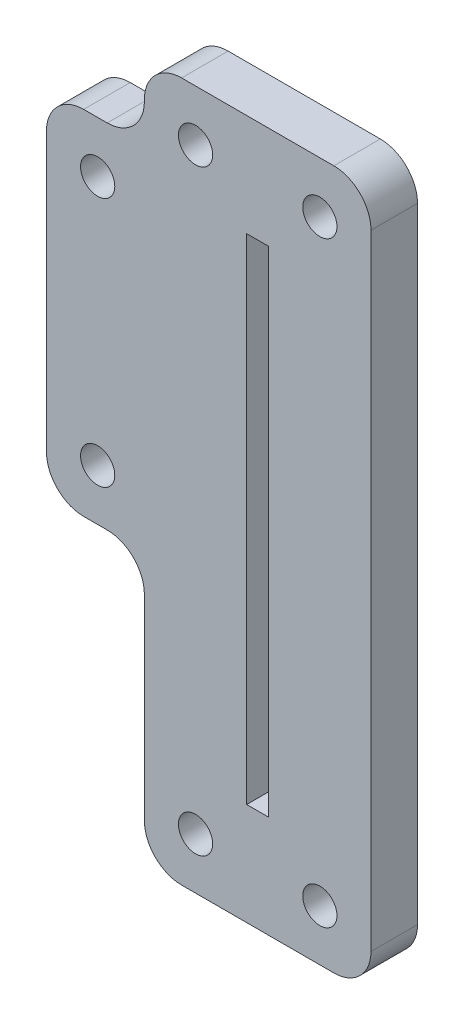
ISO-10303-21;
HEADER;
FILE_DESCRIPTION(('STEP AP214'),'2;1');
FILE_NAME('part.step','',(''),(''),'','','');
FILE_SCHEMA(('AUTOMOTIVE_DESIGN { 1 0 10303 214 1 1 1 1 }'));
ENDSEC;
DATA;
#1=APPLICATION_CONTEXT('core data for automotive mechanical design processes');
#2=APPLICATION_PROTOCOL_DEFINITION('international standard','automotive_design',2000,#1);
#3=PRODUCT_CONTEXT('',#1,'mechanical');
#4=PRODUCT('Part','Part','',(#3));
#5=PRODUCT_RELATED_PRODUCT_CATEGORY('part','',(#4));
#6=PRODUCT_DEFINITION_FORMATION('','',#4);
#7=PRODUCT_DEFINITION_CONTEXT('part definition',#1,'design');
#8=PRODUCT_DEFINITION('design','',#6,#7);
#9=PRODUCT_DEFINITION_SHAPE('','',#8);
#10=(LENGTH_UNIT() NAMED_UNIT(*) SI_UNIT(.MILLI.,.METRE.));
#11=(NAMED_UNIT(*) PLANE_ANGLE_UNIT() SI_UNIT($,.RADIAN.));
#12=(NAMED_UNIT(*) SI_UNIT($,.STERADIAN.) SOLID_ANGLE_UNIT());
#13=UNCERTAINTY_MEASURE_WITH_UNIT(LENGTH_MEASURE(1.E-05),#10,'distance_accuracy_value','');
#14=(GEOMETRIC_REPRESENTATION_CONTEXT(3) GLOBAL_UNCERTAINTY_ASSIGNED_CONTEXT((#13)) GLOBAL_UNIT_ASSIGNED_CONTEXT((#10,
#11,#12)) REPRESENTATION_CONTEXT('',''));
#15=CARTESIAN_POINT('',(0.,0.,0.));
#16=DIRECTION('',(0.,0.,1.));
#17=DIRECTION('',(1.,0.,0.));
#18=AXIS2_PLACEMENT_3D('',#15,#16,#17);
#19=CARTESIAN_POINT('',(-33.9932404035084,-3.58249069152293,3.175));
#20=DIRECTION('',(0.,0.,1.));
#21=DIRECTION('',(1.,0.,0.));
#22=AXIS2_PLACEMENT_3D('',#19,#20,#21);
#23=PLANE('',#22);
#24=CARTESIAN_POINT('',(-50.1132404035084,-9.73674069152292,3.175));
#25=DIRECTION('',(0.,0.,1.));
#26=DIRECTION('',(1.,0.,0.));
#27=AXIS2_PLACEMENT_3D('',#24,#25,#26);
#28=CIRCLE('',#27,1.1684);
#29=CARTESIAN_POINT('',(-48.9448404035084,-9.73674069152292,3.175));
#30=VERTEX_POINT('',#29);
#31=EDGE_CURVE('E656',#30,#30,#28,.T.);
#32=ORIENTED_EDGE('',*,*,#31,.F.);
#33=EDGE_LOOP('',(#32));
#34=FACE_BOUND('',#33,.T.);
#35=CARTESIAN_POINT('',(-43.4307404035084,-45.2699906915229,3.175));
#36=DIRECTION('',(0.,0.,1.));
#37=DIRECTION('',(1.,0.,0.));
#38=AXIS2_PLACEMENT_3D('',#35,#36,#37);
#39=CIRCLE('',#38,1.1684);
#40=CARTESIAN_POINT('',(-42.2623404035084,-45.2699906915229,3.175));
#41=VERTEX_POINT('',#40);
#42=EDGE_CURVE('E668',#41,#41,#39,.T.);
#43=ORIENTED_EDGE('',*,*,#42,.F.);
#44=EDGE_LOOP('',(#43));
#45=FACE_BOUND('',#44,.T.);
#46=DIRECTION('',(1.,0.,0.));
#47=VECTOR('',#46,1.);
#48=CARTESIAN_POINT('',(-39.9382404035084,-41.7774906915229,3.175));
#49=LINE('',#48,#47);
#50=CARTESIAN_POINT('',(-39.9382404035084,-41.7774906915229,3.175));
#51=VERTEX_POINT('',#50);
#52=CARTESIAN_POINT('',(-38.4382404035084,-41.7774906915229,3.175));
#53=VERTEX_POINT('',#52);
#54=EDGE_CURVE('E178',#51,#53,#49,.T.);
#55=ORIENTED_EDGE('',*,*,#54,.F.);
#56=DIRECTION('',(0.,-1.,0.));
#57=VECTOR('',#56,1.);
#58=CARTESIAN_POINT('',(-39.9382404035084,-8.02749069152292,3.175));
#59=LINE('',#58,#57);
#60=CARTESIAN_POINT('',(-39.9382404035084,-8.02749069152292,3.175));
#61=VERTEX_POINT('',#60);
#62=EDGE_CURVE('E170',#61,#51,#59,.T.);
#63=ORIENTED_EDGE('',*,*,#62,.F.);
#64=DIRECTION('',(-1.,0.,0.));
#65=VECTOR('',#64,1.);
#66=CARTESIAN_POINT('',(-39.9382404035084,-8.02749069152292,3.175));
#67=LINE('',#66,#65);
#68=CARTESIAN_POINT('',(-38.4382404035084,-8.02749069152292,3.175));
#69=VERTEX_POINT('',#68);
#70=EDGE_CURVE('E193',#69,#61,#67,.T.);
#71=ORIENTED_EDGE('',*,*,#70,.F.);
#72=DIRECTION('',(0.,1.,0.));
#73=VECTOR('',#72,1.);
#74=CARTESIAN_POINT('',(-38.4382404035084,-8.02749069152292,3.175));
#75=LINE('',#74,#73);
#76=EDGE_CURVE('E191',#53,#69,#75,.T.);
#77=ORIENTED_EDGE('',*,*,#76,.F.);
#78=EDGE_LOOP('',(#55,#63,#71,#77));
#79=FACE_BOUND('',#78,.T.);
#80=CARTESIAN_POINT('',(-33.9932404035084,-3.58249069152293,3.175));
#81=DIRECTION('',(0.,0.,1.));
#82=DIRECTION('',(1.,0.,0.));
#83=AXIS2_PLACEMENT_3D('',#80,#81,#82);
#84=CIRCLE('',#83,2.54);
#85=CARTESIAN_POINT('',(-31.4532404035084,-3.58249069152293,3.175));
#86=VERTEX_POINT('',#85);
#87=CARTESIAN_POINT('',(-33.9932404035084,-1.04249069152293,3.175));
#88=VERTEX_POINT('',#87);
#89=EDGE_CURVE('E215',#86,#88,#84,.T.);
#90=ORIENTED_EDGE('',*,*,#89,.T.);
#91=DIRECTION('',(-1.,0.,0.));
#92=VECTOR('',#91,1.);
#93=CARTESIAN_POINT('',(-44.3832404035084,-1.04249069152293,3.175));
#94=LINE('',#93,#92);
#95=CARTESIAN_POINT('',(-44.3832404035084,-1.04249069152293,3.175));
#96=VERTEX_POINT('',#95);
#97=EDGE_CURVE('E218',#88,#96,#94,.T.);
#98=ORIENTED_EDGE('',*,*,#97,.T.);
#99=CARTESIAN_POINT('',(-44.3832404035084,-3.58249069152293,3.175));
#100=DIRECTION('',(0.,0.,1.));
#101=DIRECTION('',(1.,0.,0.));
#102=AXIS2_PLACEMENT_3D('',#99,#100,#101);
#103=CIRCLE('',#102,2.54);
#104=CARTESIAN_POINT('',(-46.9232404035084,-3.58249069152294,3.175));
#105=VERTEX_POINT('',#104);
#106=EDGE_CURVE('E221',#96,#105,#103,.T.);
#107=ORIENTED_EDGE('',*,*,#106,.T.);
#108=DIRECTION('',(0.,-1.,0.));
#109=VECTOR('',#108,1.);
#110=CARTESIAN_POINT('',(-46.9232404035084,-3.58249069152294,3.175));
#111=LINE('',#110,#109);
#112=CARTESIAN_POINT('',(-46.9232404035084,-3.7042406915229,3.175));
#113=VERTEX_POINT('',#112);
#114=EDGE_CURVE('E223',#105,#113,#111,.T.);
#115=ORIENTED_EDGE('',*,*,#114,.T.);
#116=CARTESIAN_POINT('',(-49.4632404035084,-3.70424069152292,3.175));
#117=DIRECTION('',(0.,0.,-1.));
#118=DIRECTION('',(-1.,0.,0.));
#119=AXIS2_PLACEMENT_3D('',#116,#117,#118);
#120=CIRCLE('',#119,2.54);
#121=CARTESIAN_POINT('',(-49.4632404035084,-6.24424069152292,3.175));
#122=VERTEX_POINT('',#121);
#123=EDGE_CURVE('E225',#113,#122,#120,.T.);
#124=ORIENTED_EDGE('',*,*,#123,.T.);
#125=DIRECTION('',(-1.,0.,0.));
#126=VECTOR('',#125,1.);
#127=CARTESIAN_POINT('',(-51.0657404035084,-6.24424069152292,3.175));
#128=LINE('',#127,#126);
#129=CARTESIAN_POINT('',(-51.0657404035084,-6.24424069152292,3.175));
#130=VERTEX_POINT('',#129);
#131=EDGE_CURVE('E227',#122,#130,#128,.T.);
#132=ORIENTED_EDGE('',*,*,#131,.T.);
#133=CARTESIAN_POINT('',(-51.0657404035084,-8.78424069152292,3.175));
#134=DIRECTION('',(0.,0.,1.));
#135=DIRECTION('',(-1.,0.,0.));
#136=AXIS2_PLACEMENT_3D('',#133,#134,#135);
#137=CIRCLE('',#136,2.54);
#138=CARTESIAN_POINT('',(-53.6057404035084,-8.78424069152294,3.175));
#139=VERTEX_POINT('',#138);
#140=EDGE_CURVE('E229',#130,#139,#137,.T.);
#141=ORIENTED_EDGE('',*,*,#140,.T.);
#142=DIRECTION('',(0.,-1.,0.));
#143=VECTOR('',#142,1.);
#144=CARTESIAN_POINT('',(-53.6057404035084,-8.78424069152294,3.175));
#145=LINE('',#144,#143);
#146=CARTESIAN_POINT('',(-53.6057404035084,-27.7707406915229,3.175));
#147=VERTEX_POINT('',#146);
#148=EDGE_CURVE('E231',#139,#147,#145,.T.);
#149=ORIENTED_EDGE('',*,*,#148,.T.);
#150=CARTESIAN_POINT('',(-51.0657404035084,-27.7707406915229,3.175));
#151=DIRECTION('',(0.,0.,1.));
#152=DIRECTION('',(1.,0.,0.));
#153=AXIS2_PLACEMENT_3D('',#150,#151,#152);
#154=CIRCLE('',#153,2.54);
#155=CARTESIAN_POINT('',(-51.0657404035084,-30.3107406915229,3.175));
#156=VERTEX_POINT('',#155);
#157=EDGE_CURVE('E233',#147,#156,#154,.T.);
#158=ORIENTED_EDGE('',*,*,#157,.T.);
#159=DIRECTION('',(1.,0.,0.));
#160=VECTOR('',#159,1.);
#161=CARTESIAN_POINT('',(-49.4632404035084,-30.3107406915229,3.175));
#162=LINE('',#161,#160);
#163=CARTESIAN_POINT('',(-49.4632404035084,-30.3107406915229,3.175));
#164=VERTEX_POINT('',#163);
#165=EDGE_CURVE('E235',#156,#164,#162,.T.);
#166=ORIENTED_EDGE('',*,*,#165,.T.);
#167=CARTESIAN_POINT('',(-49.4632404035084,-32.8507406915229,3.175));
#168=DIRECTION('',(0.,0.,-1.));
#169=DIRECTION('',(1.,0.,0.));
#170=AXIS2_PLACEMENT_3D('',#167,#168,#169);
#171=CIRCLE('',#170,2.54);
#172=CARTESIAN_POINT('',(-46.9232404035084,-32.8507406915229,3.175));
#173=VERTEX_POINT('',#172);
#174=EDGE_CURVE('E237',#164,#173,#171,.T.);
#175=ORIENTED_EDGE('',*,*,#174,.T.);
#176=DIRECTION('',(0.,-1.,0.));
#177=VECTOR('',#176,1.);
#178=CARTESIAN_POINT('',(-46.9232404035084,-46.2224906915229,3.175));
#179=LINE('',#178,#177);
#180=CARTESIAN_POINT('',(-46.9232404035084,-46.2224906915229,3.175));
#181=VERTEX_POINT('',#180);
#182=EDGE_CURVE('E239',#173,#181,#179,.T.);
#183=ORIENTED_EDGE('',*,*,#182,.T.);
#184=CARTESIAN_POINT('',(-44.3832404035084,-46.2224906915229,3.175));
#185=DIRECTION('',(0.,0.,1.));
#186=DIRECTION('',(1.,0.,0.));
#187=AXIS2_PLACEMENT_3D('',#184,#185,#186);
#188=CIRCLE('',#187,2.54);
#189=CARTESIAN_POINT('',(-44.3832404035084,-48.7624906915229,3.175));
#190=VERTEX_POINT('',#189);
#191=EDGE_CURVE('E241',#181,#190,#188,.T.);
#192=ORIENTED_EDGE('',*,*,#191,.T.);
#193=DIRECTION('',(1.,0.,0.));
#194=VECTOR('',#193,1.);
#195=CARTESIAN_POINT('',(-44.3832404035084,-48.7624906915229,3.175));
#196=LINE('',#195,#194);
#197=CARTESIAN_POINT('',(-33.9932404035084,-48.7624906915229,3.175));
#198=VERTEX_POINT('',#197);
#199=EDGE_CURVE('E243',#190,#198,#196,.T.);
#200=ORIENTED_EDGE('',*,*,#199,.T.);
#201=CARTESIAN_POINT('',(-33.9932404035084,-46.2224906915229,3.175));
#202=DIRECTION('',(0.,0.,1.));
#203=DIRECTION('',(-1.,0.,0.));
#204=AXIS2_PLACEMENT_3D('',#201,#202,#203);
#205=CIRCLE('',#204,2.54);
#206=CARTESIAN_POINT('',(-31.4532404035084,-46.2224906915229,3.175));
#207=VERTEX_POINT('',#206);
#208=EDGE_CURVE('E245',#198,#207,#205,.T.);
#209=ORIENTED_EDGE('',*,*,#208,.T.);
#210=DIRECTION('',(0.,1.,0.));
#211=VECTOR('',#210,1.);
#212=CARTESIAN_POINT('',(-31.4532404035084,-3.58249069152293,3.175));
#213=LINE('',#212,#211);
#214=EDGE_CURVE('E247',#207,#86,#213,.T.);
#215=ORIENTED_EDGE('',*,*,#214,.T.);
#216=EDGE_LOOP('',(#90,#98,#107,#115,#124,#132,#141,#149,#158,#166,#175,#183,#192,#200,#209,#215));
#217=FACE_BOUND('',#216,.T.);
#218=CARTESIAN_POINT('',(-43.4307404035084,-4.53499069152293,3.175));
#219=DIRECTION('',(0.,0.,1.));
#220=DIRECTION('',(1.,0.,0.));
#221=AXIS2_PLACEMENT_3D('',#218,#219,#220);
#222=CIRCLE('',#221,1.1684);
#223=CARTESIAN_POINT('',(-42.2623404035084,-4.53499069152293,3.175));
#224=VERTEX_POINT('',#223);
#225=EDGE_CURVE('E209',#224,#224,#222,.T.);
#226=ORIENTED_EDGE('',*,*,#225,.F.);
#227=EDGE_LOOP('',(#226));
#228=FACE_BOUND('',#227,.T.);
#229=CARTESIAN_POINT('',(-34.9457404035084,-4.53499069152293,3.175));
#230=DIRECTION('',(0.,0.,1.));
#231=DIRECTION('',(1.,0.,0.));
#232=AXIS2_PLACEMENT_3D('',#229,#230,#231);
#233=CIRCLE('',#232,1.1684);
#234=CARTESIAN_POINT('',(-33.7773404035084,-4.53499069152293,3.175));
#235=VERTEX_POINT('',#234);
#236=EDGE_CURVE('E199',#235,#235,#233,.T.);
#237=ORIENTED_EDGE('',*,*,#236,.F.);
#238=EDGE_LOOP('',(#237));
#239=FACE_BOUND('',#238,.T.);
#240=CARTESIAN_POINT('',(-34.9457404035084,-45.2699906915229,3.175));
#241=DIRECTION('',(0.,0.,1.));
#242=DIRECTION('',(1.,0.,0.));
#243=AXIS2_PLACEMENT_3D('',#240,#241,#242);
#244=CIRCLE('',#243,1.1684);
#245=CARTESIAN_POINT('',(-33.7773404035084,-45.2699906915229,3.175));
#246=VERTEX_POINT('',#245);
#247=EDGE_CURVE('E662',#246,#246,#244,.T.);
#248=ORIENTED_EDGE('',*,*,#247,.F.);
#249=EDGE_LOOP('',(#248));
#250=FACE_BOUND('',#249,.T.);
#251=CARTESIAN_POINT('',(-50.1132404035084,-26.8182406915229,3.175));
#252=DIRECTION('',(0.,0.,1.));
#253=DIRECTION('',(1.,0.,0.));
#254=AXIS2_PLACEMENT_3D('',#251,#252,#253);
#255=CIRCLE('',#254,1.1684);
#256=CARTESIAN_POINT('',(-48.9448404035084,-26.8182406915229,3.175));
#257=VERTEX_POINT('',#256);
#258=EDGE_CURVE('E647',#257,#257,#255,.T.);
#259=ORIENTED_EDGE('',*,*,#258,.F.);
#260=EDGE_LOOP('',(#259));
#261=FACE_BOUND('',#260,.T.);
#262=ADVANCED_FACE('F33',(#34,#45,#79,#217,#228,#239,#250,#261),#23,.T.);
#263=CARTESIAN_POINT('',(-33.9932404035084,-3.58249069152293,0.));
#264=DIRECTION('',(0.,0.,1.));
#265=DIRECTION('',(1.,0.,0.));
#266=AXIS2_PLACEMENT_3D('',#263,#264,#265);
#267=PLANE('',#266);
#268=CARTESIAN_POINT('',(-50.1132404035084,-9.73674069152292,0.));
#269=DIRECTION('',(0.,0.,1.));
#270=DIRECTION('',(1.,0.,0.));
#271=AXIS2_PLACEMENT_3D('',#268,#269,#270);
#272=CIRCLE('',#271,1.1684);
#273=CARTESIAN_POINT('',(-48.9448404035084,-9.73674069152292,0.));
#274=VERTEX_POINT('',#273);
#275=EDGE_CURVE('E653',#274,#274,#272,.T.);
#276=ORIENTED_EDGE('',*,*,#275,.T.);
#277=EDGE_LOOP('',(#276));
#278=FACE_BOUND('',#277,.T.);
#279=CARTESIAN_POINT('',(-43.4307404035084,-45.2699906915229,0.));
#280=DIRECTION('',(0.,0.,1.));
#281=DIRECTION('',(1.,0.,0.));
#282=AXIS2_PLACEMENT_3D('',#279,#280,#281);
#283=CIRCLE('',#282,1.1684);
#284=CARTESIAN_POINT('',(-42.2623404035084,-45.2699906915229,0.));
#285=VERTEX_POINT('',#284);
#286=EDGE_CURVE('E665',#285,#285,#283,.T.);
#287=ORIENTED_EDGE('',*,*,#286,.T.);
#288=EDGE_LOOP('',(#287));
#289=FACE_BOUND('',#288,.T.);
#290=DIRECTION('',(0.,-1.,0.));
#291=VECTOR('',#290,1.);
#292=CARTESIAN_POINT('',(-39.9382404035084,-8.02749069152292,0.));
#293=LINE('',#292,#291);
#294=CARTESIAN_POINT('',(-39.9382404035084,-8.02749069152292,0.));
#295=VERTEX_POINT('',#294);
#296=CARTESIAN_POINT('',(-39.9382404035084,-41.7774906915229,0.));
#297=VERTEX_POINT('',#296);
#298=EDGE_CURVE('E56',#295,#297,#293,.T.);
#299=ORIENTED_EDGE('',*,*,#298,.T.);
#300=DIRECTION('',(1.,0.,0.));
#301=VECTOR('',#300,1.);
#302=CARTESIAN_POINT('',(-39.9382404035084,-41.7774906915229,0.));
#303=LINE('',#302,#301);
#304=CARTESIAN_POINT('',(-38.4382404035084,-41.7774906915229,0.));
#305=VERTEX_POINT('',#304);
#306=EDGE_CURVE('E185',#297,#305,#303,.T.);
#307=ORIENTED_EDGE('',*,*,#306,.T.);
#308=DIRECTION('',(0.,1.,0.));
#309=VECTOR('',#308,1.);
#310=CARTESIAN_POINT('',(-38.4382404035084,-8.02749069152292,0.));
#311=LINE('',#310,#309);
#312=CARTESIAN_POINT('',(-38.4382404035084,-8.02749069152292,0.));
#313=VERTEX_POINT('',#312);
#314=EDGE_CURVE('E201',#305,#313,#311,.T.);
#315=ORIENTED_EDGE('',*,*,#314,.T.);
#316=DIRECTION('',(-1.,0.,0.));
#317=VECTOR('',#316,1.);
#318=CARTESIAN_POINT('',(-39.9382404035084,-8.02749069152292,0.));
#319=LINE('',#318,#317);
#320=EDGE_CURVE('E179',#313,#295,#319,.T.);
#321=ORIENTED_EDGE('',*,*,#320,.T.);
#322=EDGE_LOOP('',(#299,#307,#315,#321));
#323=FACE_BOUND('',#322,.T.);
#324=CARTESIAN_POINT('',(-33.9932404035084,-3.58249069152293,0.));
#325=DIRECTION('',(0.,0.,1.));
#326=DIRECTION('',(1.,0.,0.));
#327=AXIS2_PLACEMENT_3D('',#324,#325,#326);
#328=CIRCLE('',#327,2.54);
#329=CARTESIAN_POINT('',(-31.4532404035084,-3.58249069152293,0.));
#330=VERTEX_POINT('',#329);
#331=CARTESIAN_POINT('',(-33.9932404035084,-1.04249069152293,0.));
#332=VERTEX_POINT('',#331);
#333=EDGE_CURVE('E212',#330,#332,#328,.T.);
#334=ORIENTED_EDGE('',*,*,#333,.F.);
#335=DIRECTION('',(0.,1.,0.));
#336=VECTOR('',#335,1.);
#337=CARTESIAN_POINT('',(-31.4532404035084,-3.58249069152293,0.));
#338=LINE('',#337,#336);
#339=CARTESIAN_POINT('',(-31.4532404035084,-46.2224906915229,0.));
#340=VERTEX_POINT('',#339);
#341=EDGE_CURVE('E219',#340,#330,#338,.T.);
#342=ORIENTED_EDGE('',*,*,#341,.F.);
#343=CARTESIAN_POINT('',(-33.9932404035084,-46.2224906915229,0.));
#344=DIRECTION('',(0.,0.,1.));
#345=DIRECTION('',(-1.,0.,0.));
#346=AXIS2_PLACEMENT_3D('',#343,#344,#345);
#347=CIRCLE('',#346,2.54);
#348=CARTESIAN_POINT('',(-33.9932404035084,-48.7624906915229,0.));
#349=VERTEX_POINT('',#348);
#350=EDGE_CURVE('E278',#349,#340,#347,.T.);
#351=ORIENTED_EDGE('',*,*,#350,.F.);
#352=DIRECTION('',(1.,0.,0.));
#353=VECTOR('',#352,1.);
#354=CARTESIAN_POINT('',(-44.3832404035084,-48.7624906915229,0.));
#355=LINE('',#354,#353);
#356=CARTESIAN_POINT('',(-44.3832404035084,-48.7624906915229,0.));
#357=VERTEX_POINT('',#356);
#358=EDGE_CURVE('E276',#357,#349,#355,.T.);
#359=ORIENTED_EDGE('',*,*,#358,.F.);
#360=CARTESIAN_POINT('',(-44.3832404035084,-46.2224906915229,0.));
#361=DIRECTION('',(0.,0.,1.));
#362=DIRECTION('',(1.,0.,0.));
#363=AXIS2_PLACEMENT_3D('',#360,#361,#362);
#364=CIRCLE('',#363,2.54);
#365=CARTESIAN_POINT('',(-46.9232404035084,-46.2224906915229,0.));
#366=VERTEX_POINT('',#365);
#367=EDGE_CURVE('E274',#366,#357,#364,.T.);
#368=ORIENTED_EDGE('',*,*,#367,.F.);
#369=DIRECTION('',(0.,-1.,0.));
#370=VECTOR('',#369,1.);
#371=CARTESIAN_POINT('',(-46.9232404035084,-46.2224906915229,0.));
#372=LINE('',#371,#370);
#373=CARTESIAN_POINT('',(-46.9232404035084,-32.8507406915229,0.));
#374=VERTEX_POINT('',#373);
#375=EDGE_CURVE('E272',#374,#366,#372,.T.);
#376=ORIENTED_EDGE('',*,*,#375,.F.);
#377=CARTESIAN_POINT('',(-49.4632404035084,-32.8507406915229,0.));
#378=DIRECTION('',(0.,0.,-1.));
#379=DIRECTION('',(1.,0.,0.));
#380=AXIS2_PLACEMENT_3D('',#377,#378,#379);
#381=CIRCLE('',#380,2.54);
#382=CARTESIAN_POINT('',(-49.4632404035084,-30.3107406915229,0.));
#383=VERTEX_POINT('',#382);
#384=EDGE_CURVE('E270',#383,#374,#381,.T.);
#385=ORIENTED_EDGE('',*,*,#384,.F.);
#386=DIRECTION('',(1.,0.,0.));
#387=VECTOR('',#386,1.);
#388=CARTESIAN_POINT('',(-49.4632404035084,-30.3107406915229,0.));
#389=LINE('',#388,#387);
#390=CARTESIAN_POINT('',(-51.0657404035084,-30.3107406915229,0.));
#391=VERTEX_POINT('',#390);
#392=EDGE_CURVE('E268',#391,#383,#389,.T.);
#393=ORIENTED_EDGE('',*,*,#392,.F.);
#394=CARTESIAN_POINT('',(-51.0657404035084,-27.7707406915229,0.));
#395=DIRECTION('',(0.,0.,1.));
#396=DIRECTION('',(1.,0.,0.));
#397=AXIS2_PLACEMENT_3D('',#394,#395,#396);
#398=CIRCLE('',#397,2.54);
#399=CARTESIAN_POINT('',(-53.6057404035084,-27.7707406915229,0.));
#400=VERTEX_POINT('',#399);
#401=EDGE_CURVE('E266',#400,#391,#398,.T.);
#402=ORIENTED_EDGE('',*,*,#401,.F.);
#403=DIRECTION('',(0.,-1.,0.));
#404=VECTOR('',#403,1.);
#405=CARTESIAN_POINT('',(-53.6057404035084,-8.78424069152294,0.));
#406=LINE('',#405,#404);
#407=CARTESIAN_POINT('',(-53.6057404035084,-8.78424069152294,0.));
#408=VERTEX_POINT('',#407);
#409=EDGE_CURVE('E264',#408,#400,#406,.T.);
#410=ORIENTED_EDGE('',*,*,#409,.F.);
#411=CARTESIAN_POINT('',(-51.0657404035084,-8.78424069152292,0.));
#412=DIRECTION('',(0.,0.,1.));
#413=DIRECTION('',(-1.,0.,0.));
#414=AXIS2_PLACEMENT_3D('',#411,#412,#413);
#415=CIRCLE('',#414,2.54);
#416=CARTESIAN_POINT('',(-51.0657404035084,-6.24424069152292,0.));
#417=VERTEX_POINT('',#416);
#418=EDGE_CURVE('E262',#417,#408,#415,.T.);
#419=ORIENTED_EDGE('',*,*,#418,.F.);
#420=DIRECTION('',(-1.,0.,0.));
#421=VECTOR('',#420,1.);
#422=CARTESIAN_POINT('',(-51.0657404035084,-6.24424069152292,0.));
#423=LINE('',#422,#421);
#424=CARTESIAN_POINT('',(-49.4632404035084,-6.24424069152292,0.));
#425=VERTEX_POINT('',#424);
#426=EDGE_CURVE('E260',#425,#417,#423,.T.);
#427=ORIENTED_EDGE('',*,*,#426,.F.);
#428=CARTESIAN_POINT('',(-49.4632404035084,-3.70424069152292,0.));
#429=DIRECTION('',(0.,0.,-1.));
#430=DIRECTION('',(-1.,0.,0.));
#431=AXIS2_PLACEMENT_3D('',#428,#429,#430);
#432=CIRCLE('',#431,2.54);
#433=CARTESIAN_POINT('',(-46.9232404035084,-3.7042406915229,0.));
#434=VERTEX_POINT('',#433);
#435=EDGE_CURVE('E258',#434,#425,#432,.T.);
#436=ORIENTED_EDGE('',*,*,#435,.F.);
#437=DIRECTION('',(0.,-1.,0.));
#438=VECTOR('',#437,1.);
#439=CARTESIAN_POINT('',(-46.9232404035084,-3.58249069152294,0.));
#440=LINE('',#439,#438);
#441=CARTESIAN_POINT('',(-46.9232404035084,-3.58249069152294,0.));
#442=VERTEX_POINT('',#441);
#443=EDGE_CURVE('E256',#442,#434,#440,.T.);
#444=ORIENTED_EDGE('',*,*,#443,.F.);
#445=CARTESIAN_POINT('',(-44.3832404035084,-3.58249069152293,0.));
#446=DIRECTION('',(0.,0.,1.));
#447=DIRECTION('',(1.,0.,0.));
#448=AXIS2_PLACEMENT_3D('',#445,#446,#447);
#449=CIRCLE('',#448,2.54);
#450=CARTESIAN_POINT('',(-44.3832404035084,-1.04249069152293,0.));
#451=VERTEX_POINT('',#450);
#452=EDGE_CURVE('E254',#451,#442,#449,.T.);
#453=ORIENTED_EDGE('',*,*,#452,.F.);
#454=DIRECTION('',(-1.,0.,0.));
#455=VECTOR('',#454,1.);
#456=CARTESIAN_POINT('',(-44.3832404035084,-1.04249069152293,0.));
#457=LINE('',#456,#455);
#458=EDGE_CURVE('E252',#332,#451,#457,.T.);
#459=ORIENTED_EDGE('',*,*,#458,.F.);
#460=EDGE_LOOP('',(#334,#342,#351,#359,#368,#376,#385,#393,#402,#410,#419,#427,#436,#444,#453,#459));
#461=FACE_BOUND('',#460,.T.);
#462=CARTESIAN_POINT('',(-43.4307404035084,-4.53499069152293,0.));
#463=DIRECTION('',(0.,0.,1.));
#464=DIRECTION('',(1.,0.,0.));
#465=AXIS2_PLACEMENT_3D('',#462,#463,#464);
#466=CIRCLE('',#465,1.1684);
#467=CARTESIAN_POINT('',(-42.2623404035084,-4.53499069152293,0.));
#468=VERTEX_POINT('',#467);
#469=EDGE_CURVE('E186',#468,#468,#466,.T.);
#470=ORIENTED_EDGE('',*,*,#469,.T.);
#471=EDGE_LOOP('',(#470));
#472=FACE_BOUND('',#471,.T.);
#473=CARTESIAN_POINT('',(-34.9457404035084,-4.53499069152293,0.));
#474=DIRECTION('',(0.,0.,1.));
#475=DIRECTION('',(1.,0.,0.));
#476=AXIS2_PLACEMENT_3D('',#473,#474,#475);
#477=CIRCLE('',#476,1.1684);
#478=CARTESIAN_POINT('',(-33.7773404035084,-4.53499069152293,0.));
#479=VERTEX_POINT('',#478);
#480=EDGE_CURVE('E671',#479,#479,#477,.T.);
#481=ORIENTED_EDGE('',*,*,#480,.T.);
#482=EDGE_LOOP('',(#481));
#483=FACE_BOUND('',#482,.T.);
#484=CARTESIAN_POINT('',(-34.9457404035084,-45.2699906915229,0.));
#485=DIRECTION('',(0.,0.,1.));
#486=DIRECTION('',(1.,0.,0.));
#487=AXIS2_PLACEMENT_3D('',#484,#485,#486);
#488=CIRCLE('',#487,1.1684);
#489=CARTESIAN_POINT('',(-33.7773404035084,-45.2699906915229,0.));
#490=VERTEX_POINT('',#489);
#491=EDGE_CURVE('E659',#490,#490,#488,.T.);
#492=ORIENTED_EDGE('',*,*,#491,.T.);
#493=EDGE_LOOP('',(#492));
#494=FACE_BOUND('',#493,.T.);
#495=CARTESIAN_POINT('',(-50.1132404035084,-26.8182406915229,0.));
#496=DIRECTION('',(0.,0.,1.));
#497=DIRECTION('',(1.,0.,0.));
#498=AXIS2_PLACEMENT_3D('',#495,#496,#497);
#499=CIRCLE('',#498,1.1684);
#500=CARTESIAN_POINT('',(-48.9448404035084,-26.8182406915229,0.));
#501=VERTEX_POINT('',#500);
#502=EDGE_CURVE('E650',#501,#501,#499,.T.);
#503=ORIENTED_EDGE('',*,*,#502,.T.);
#504=EDGE_LOOP('',(#503));
#505=FACE_BOUND('',#504,.T.);
#506=ADVANCED_FACE('F332',(#278,#289,#323,#461,#472,#483,#494,#505),#267,.F.);
#507=CARTESIAN_POINT('',(-33.9932404035084,-3.58249069152293,3.175));
#508=DIRECTION('',(0.,0.,-1.));
#509=DIRECTION('',(-1.,0.,0.));
#510=AXIS2_PLACEMENT_3D('',#507,#508,#509);
#511=CYLINDRICAL_SURFACE('',#510,2.54);
#512=ORIENTED_EDGE('',*,*,#333,.T.);
#513=DIRECTION('',(0.,0.,-1.));
#514=VECTOR('',#513,1.);
#515=CARTESIAN_POINT('',(-33.9932404035084,-1.04249069152293,3.175));
#516=LINE('',#515,#514);
#517=EDGE_CURVE('E11',#88,#332,#516,.T.);
#518=ORIENTED_EDGE('',*,*,#517,.F.);
#519=ORIENTED_EDGE('',*,*,#89,.F.);
#520=DIRECTION('',(0.,0.,-1.));
#521=VECTOR('',#520,1.);
#522=CARTESIAN_POINT('',(-31.4532404035084,-3.58249069152293,3.175));
#523=LINE('',#522,#521);
#524=EDGE_CURVE('E249',#86,#330,#523,.T.);
#525=ORIENTED_EDGE('',*,*,#524,.T.);
#526=EDGE_LOOP('',(#512,#518,#519,#525));
#527=FACE_BOUND('',#526,.T.);
#528=ADVANCED_FACE('F35',(#527),#511,.T.);
#529=CARTESIAN_POINT('',(-44.3832404035084,-1.04249069152293,3.175));
#530=DIRECTION('',(0.,-1.,0.));
#531=DIRECTION('',(0.,0.,-1.));
#532=AXIS2_PLACEMENT_3D('',#529,#530,#531);
#533=PLANE('',#532);
#534=ORIENTED_EDGE('',*,*,#458,.T.);
#535=DIRECTION('',(0.,0.,-1.));
#536=VECTOR('',#535,1.);
#537=CARTESIAN_POINT('',(-44.3832404035084,-1.04249069152293,3.175));
#538=LINE('',#537,#536);
#539=EDGE_CURVE('E41',#96,#451,#538,.T.);
#540=ORIENTED_EDGE('',*,*,#539,.F.);
#541=ORIENTED_EDGE('',*,*,#97,.F.);
#542=ORIENTED_EDGE('',*,*,#517,.T.);
#543=EDGE_LOOP('',(#534,#540,#541,#542));
#544=FACE_BOUND('',#543,.T.);
#545=ADVANCED_FACE('F349',(#544),#533,.F.);
#546=CARTESIAN_POINT('',(-44.3832404035084,-3.58249069152293,3.175));
#547=DIRECTION('',(0.,0.,-1.));
#548=DIRECTION('',(-1.,0.,0.));
#549=AXIS2_PLACEMENT_3D('',#546,#547,#548);
#550=CYLINDRICAL_SURFACE('',#549,2.54);
#551=ORIENTED_EDGE('',*,*,#452,.T.);
#552=DIRECTION('',(0.,0.,-1.));
#553=VECTOR('',#552,1.);
#554=CARTESIAN_POINT('',(-46.9232404035084,-3.58249069152294,3.175));
#555=LINE('',#554,#553);
#556=EDGE_CURVE('E319',#105,#442,#555,.T.);
#557=ORIENTED_EDGE('',*,*,#556,.F.);
#558=ORIENTED_EDGE('',*,*,#106,.F.);
#559=ORIENTED_EDGE('',*,*,#539,.T.);
#560=EDGE_LOOP('',(#551,#557,#558,#559));
#561=FACE_BOUND('',#560,.T.);
#562=ADVANCED_FACE('F326',(#561),#550,.T.);
#563=CARTESIAN_POINT('',(-46.9232404035084,-3.58249069152294,3.175));
#564=DIRECTION('',(1.,0.,0.));
#565=DIRECTION('',(0.,0.,-1.));
#566=AXIS2_PLACEMENT_3D('',#563,#564,#565);
#567=PLANE('',#566);
#568=ORIENTED_EDGE('',*,*,#443,.T.);
#569=DIRECTION('',(0.,0.,-1.));
#570=VECTOR('',#569,1.);
#571=CARTESIAN_POINT('',(-46.9232404035084,-3.7042406915229,3.175));
#572=LINE('',#571,#570);
#573=EDGE_CURVE('E316',#113,#434,#572,.T.);
#574=ORIENTED_EDGE('',*,*,#573,.F.);
#575=ORIENTED_EDGE('',*,*,#114,.F.);
#576=ORIENTED_EDGE('',*,*,#556,.T.);
#577=EDGE_LOOP('',(#568,#574,#575,#576));
#578=FACE_BOUND('',#577,.T.);
#579=ADVANCED_FACE('F338',(#578),#567,.F.);
#580=CARTESIAN_POINT('',(-49.4632404035084,-3.70424069152292,3.175));
#581=DIRECTION('',(0.,0.,-1.));
#582=DIRECTION('',(-1.,0.,0.));
#583=AXIS2_PLACEMENT_3D('',#580,#581,#582);
#584=CYLINDRICAL_SURFACE('',#583,2.54);
#585=ORIENTED_EDGE('',*,*,#435,.T.);
#586=DIRECTION('',(0.,0.,-1.));
#587=VECTOR('',#586,1.);
#588=CARTESIAN_POINT('',(-49.4632404035084,-6.24424069152292,3.175));
#589=LINE('',#588,#587);
#590=EDGE_CURVE('E313',#122,#425,#589,.T.);
#591=ORIENTED_EDGE('',*,*,#590,.F.);
#592=ORIENTED_EDGE('',*,*,#123,.F.);
#593=ORIENTED_EDGE('',*,*,#573,.T.);
#594=EDGE_LOOP('',(#585,#591,#592,#593));
#595=FACE_BOUND('',#594,.T.);
#596=ADVANCED_FACE('F342',(#595),#584,.F.);
#597=CARTESIAN_POINT('',(-51.0657404035084,-6.24424069152292,3.175));
#598=DIRECTION('',(0.,-1.,0.));
#599=DIRECTION('',(0.,0.,-1.));
#600=AXIS2_PLACEMENT_3D('',#597,#598,#599);
#601=PLANE('',#600);
#602=ORIENTED_EDGE('',*,*,#426,.T.);
#603=DIRECTION('',(0.,0.,-1.));
#604=VECTOR('',#603,1.);
#605=CARTESIAN_POINT('',(-51.0657404035084,-6.24424069152292,3.175));
#606=LINE('',#605,#604);
#607=EDGE_CURVE('E310',#130,#417,#606,.T.);
#608=ORIENTED_EDGE('',*,*,#607,.F.);
#609=ORIENTED_EDGE('',*,*,#131,.F.);
#610=ORIENTED_EDGE('',*,*,#590,.T.);
#611=EDGE_LOOP('',(#602,#608,#609,#610));
#612=FACE_BOUND('',#611,.T.);
#613=ADVANCED_FACE('F402',(#612),#601,.F.);
#614=CARTESIAN_POINT('',(-51.0657404035084,-8.78424069152292,3.175));
#615=DIRECTION('',(0.,0.,-1.));
#616=DIRECTION('',(-1.,0.,0.));
#617=AXIS2_PLACEMENT_3D('',#614,#615,#616);
#618=CYLINDRICAL_SURFACE('',#617,2.54);
#619=ORIENTED_EDGE('',*,*,#418,.T.);
#620=DIRECTION('',(0.,0.,-1.));
#621=VECTOR('',#620,1.);
#622=CARTESIAN_POINT('',(-53.6057404035084,-8.78424069152294,3.175));
#623=LINE('',#622,#621);
#624=EDGE_CURVE('E307',#139,#408,#623,.T.);
#625=ORIENTED_EDGE('',*,*,#624,.F.);
#626=ORIENTED_EDGE('',*,*,#140,.F.);
#627=ORIENTED_EDGE('',*,*,#607,.T.);
#628=EDGE_LOOP('',(#619,#625,#626,#627));
#629=FACE_BOUND('',#628,.T.);
#630=ADVANCED_FACE('F399',(#629),#618,.T.);
#631=CARTESIAN_POINT('',(-53.6057404035084,-8.78424069152294,3.175));
#632=DIRECTION('',(1.,0.,0.));
#633=DIRECTION('',(0.,0.,-1.));
#634=AXIS2_PLACEMENT_3D('',#631,#632,#633);
#635=PLANE('',#634);
#636=ORIENTED_EDGE('',*,*,#409,.T.);
#637=DIRECTION('',(0.,0.,-1.));
#638=VECTOR('',#637,1.);
#639=CARTESIAN_POINT('',(-53.6057404035084,-27.7707406915229,3.175));
#640=LINE('',#639,#638);
#641=EDGE_CURVE('E304',#147,#400,#640,.T.);
#642=ORIENTED_EDGE('',*,*,#641,.F.);
#643=ORIENTED_EDGE('',*,*,#148,.F.);
#644=ORIENTED_EDGE('',*,*,#624,.T.);
#645=EDGE_LOOP('',(#636,#642,#643,#644));
#646=FACE_BOUND('',#645,.T.);
#647=ADVANCED_FACE('F395',(#646),#635,.F.);
#648=CARTESIAN_POINT('',(-51.0657404035084,-27.7707406915229,3.175));
#649=DIRECTION('',(0.,0.,-1.));
#650=DIRECTION('',(-1.,0.,0.));
#651=AXIS2_PLACEMENT_3D('',#648,#649,#650);
#652=CYLINDRICAL_SURFACE('',#651,2.54);
#653=ORIENTED_EDGE('',*,*,#401,.T.);
#654=DIRECTION('',(0.,0.,-1.));
#655=VECTOR('',#654,1.);
#656=CARTESIAN_POINT('',(-51.0657404035084,-30.3107406915229,3.175));
#657=LINE('',#656,#655);
#658=EDGE_CURVE('E301',#156,#391,#657,.T.);
#659=ORIENTED_EDGE('',*,*,#658,.F.);
#660=ORIENTED_EDGE('',*,*,#157,.F.);
#661=ORIENTED_EDGE('',*,*,#641,.T.);
#662=EDGE_LOOP('',(#653,#659,#660,#661));
#663=FACE_BOUND('',#662,.T.);
#664=ADVANCED_FACE('F391',(#663),#652,.T.);
#665=CARTESIAN_POINT('',(-49.4632404035084,-30.3107406915229,3.175));
#666=DIRECTION('',(0.,1.,0.));
#667=DIRECTION('',(0.,0.,1.));
#668=AXIS2_PLACEMENT_3D('',#665,#666,#667);
#669=PLANE('',#668);
#670=ORIENTED_EDGE('',*,*,#392,.T.);
#671=DIRECTION('',(0.,0.,-1.));
#672=VECTOR('',#671,1.);
#673=CARTESIAN_POINT('',(-49.4632404035084,-30.3107406915229,3.175));
#674=LINE('',#673,#672);
#675=EDGE_CURVE('E298',#164,#383,#674,.T.);
#676=ORIENTED_EDGE('',*,*,#675,.F.);
#677=ORIENTED_EDGE('',*,*,#165,.F.);
#678=ORIENTED_EDGE('',*,*,#658,.T.);
#679=EDGE_LOOP('',(#670,#676,#677,#678));
#680=FACE_BOUND('',#679,.T.);
#681=ADVANCED_FACE('F386',(#680),#669,.F.);
#682=CARTESIAN_POINT('',(-49.4632404035084,-32.8507406915229,3.175));
#683=DIRECTION('',(0.,0.,-1.));
#684=DIRECTION('',(-1.,0.,0.));
#685=AXIS2_PLACEMENT_3D('',#682,#683,#684);
#686=CYLINDRICAL_SURFACE('',#685,2.54);
#687=ORIENTED_EDGE('',*,*,#384,.T.);
#688=DIRECTION('',(0.,0.,-1.));
#689=VECTOR('',#688,1.);
#690=CARTESIAN_POINT('',(-46.9232404035084,-32.8507406915229,3.175));
#691=LINE('',#690,#689);
#692=EDGE_CURVE('E295',#173,#374,#691,.T.);
#693=ORIENTED_EDGE('',*,*,#692,.F.);
#694=ORIENTED_EDGE('',*,*,#174,.F.);
#695=ORIENTED_EDGE('',*,*,#675,.T.);
#696=EDGE_LOOP('',(#687,#693,#694,#695));
#697=FACE_BOUND('',#696,.T.);
#698=ADVANCED_FACE('F380',(#697),#686,.F.);
#699=CARTESIAN_POINT('',(-46.9232404035084,-46.2224906915229,3.175));
#700=DIRECTION('',(1.,0.,0.));
#701=DIRECTION('',(0.,0.,-1.));
#702=AXIS2_PLACEMENT_3D('',#699,#700,#701);
#703=PLANE('',#702);
#704=ORIENTED_EDGE('',*,*,#375,.T.);
#705=DIRECTION('',(0.,0.,-1.));
#706=VECTOR('',#705,1.);
#707=CARTESIAN_POINT('',(-46.9232404035084,-46.2224906915229,3.175));
#708=LINE('',#707,#706);
#709=EDGE_CURVE('E292',#181,#366,#708,.T.);
#710=ORIENTED_EDGE('',*,*,#709,.F.);
#711=ORIENTED_EDGE('',*,*,#182,.F.);
#712=ORIENTED_EDGE('',*,*,#692,.T.);
#713=EDGE_LOOP('',(#704,#710,#711,#712));
#714=FACE_BOUND('',#713,.T.);
#715=ADVANCED_FACE('F376',(#714),#703,.F.);
#716=CARTESIAN_POINT('',(-44.3832404035084,-46.2224906915229,3.175));
#717=DIRECTION('',(0.,0.,-1.));
#718=DIRECTION('',(-1.,0.,0.));
#719=AXIS2_PLACEMENT_3D('',#716,#717,#718);
#720=CYLINDRICAL_SURFACE('',#719,2.54);
#721=ORIENTED_EDGE('',*,*,#367,.T.);
#722=DIRECTION('',(0.,0.,-1.));
#723=VECTOR('',#722,1.);
#724=CARTESIAN_POINT('',(-44.3832404035084,-48.7624906915229,3.175));
#725=LINE('',#724,#723);
#726=EDGE_CURVE('E289',#190,#357,#725,.T.);
#727=ORIENTED_EDGE('',*,*,#726,.F.);
#728=ORIENTED_EDGE('',*,*,#191,.F.);
#729=ORIENTED_EDGE('',*,*,#709,.T.);
#730=EDGE_LOOP('',(#721,#727,#728,#729));
#731=FACE_BOUND('',#730,.T.);
#732=ADVANCED_FACE('F371',(#731),#720,.T.);
#733=CARTESIAN_POINT('',(-44.3832404035084,-48.7624906915229,3.175));
#734=DIRECTION('',(0.,1.,0.));
#735=DIRECTION('',(-1.,0.,0.));
#736=AXIS2_PLACEMENT_3D('',#733,#734,#735);
#737=PLANE('',#736);
#738=ORIENTED_EDGE('',*,*,#358,.T.);
#739=DIRECTION('',(0.,0.,-1.));
#740=VECTOR('',#739,1.);
#741=CARTESIAN_POINT('',(-33.9932404035084,-48.7624906915229,3.175));
#742=LINE('',#741,#740);
#743=EDGE_CURVE('E286',#198,#349,#742,.T.);
#744=ORIENTED_EDGE('',*,*,#743,.F.);
#745=ORIENTED_EDGE('',*,*,#199,.F.);
#746=ORIENTED_EDGE('',*,*,#726,.T.);
#747=EDGE_LOOP('',(#738,#744,#745,#746));
#748=FACE_BOUND('',#747,.T.);
#749=ADVANCED_FACE('F365',(#748),#737,.F.);
#750=CARTESIAN_POINT('',(-33.9932404035084,-46.2224906915229,3.175));
#751=DIRECTION('',(0.,0.,-1.));
#752=DIRECTION('',(-1.,0.,0.));
#753=AXIS2_PLACEMENT_3D('',#750,#751,#752);
#754=CYLINDRICAL_SURFACE('',#753,2.54);
#755=ORIENTED_EDGE('',*,*,#350,.T.);
#756=DIRECTION('',(0.,0.,-1.));
#757=VECTOR('',#756,1.);
#758=CARTESIAN_POINT('',(-31.4532404035084,-46.2224906915229,3.175));
#759=LINE('',#758,#757);
#760=EDGE_CURVE('E283',#207,#340,#759,.T.);
#761=ORIENTED_EDGE('',*,*,#760,.F.);
#762=ORIENTED_EDGE('',*,*,#208,.F.);
#763=ORIENTED_EDGE('',*,*,#743,.T.);
#764=EDGE_LOOP('',(#755,#761,#762,#763));
#765=FACE_BOUND('',#764,.T.);
#766=ADVANCED_FACE('F361',(#765),#754,.T.);
#767=CARTESIAN_POINT('',(-31.4532404035084,-3.58249069152293,3.175));
#768=DIRECTION('',(-1.,0.,0.));
#769=DIRECTION('',(0.,-1.,0.));
#770=AXIS2_PLACEMENT_3D('',#767,#768,#769);
#771=PLANE('',#770);
#772=ORIENTED_EDGE('',*,*,#341,.T.);
#773=ORIENTED_EDGE('',*,*,#524,.F.);
#774=ORIENTED_EDGE('',*,*,#214,.F.);
#775=ORIENTED_EDGE('',*,*,#760,.T.);
#776=EDGE_LOOP('',(#772,#773,#774,#775));
#777=FACE_BOUND('',#776,.T.);
#778=ADVANCED_FACE('F356',(#777),#771,.F.);
#779=CARTESIAN_POINT('',(-43.4307404035084,-4.53499069152293,3.175));
#780=DIRECTION('',(0.,0.,-1.));
#781=DIRECTION('',(-1.,0.,0.));
#782=AXIS2_PLACEMENT_3D('',#779,#780,#781);
#783=CYLINDRICAL_SURFACE('',#782,1.1684);
#784=ORIENTED_EDGE('',*,*,#225,.T.);
#785=EDGE_LOOP('',(#784));
#786=FACE_BOUND('',#785,.T.);
#787=ORIENTED_EDGE('',*,*,#469,.F.);
#788=EDGE_LOOP('',(#787));
#789=FACE_BOUND('',#788,.T.);
#790=ADVANCED_FACE('F422',(#786,#789),#783,.F.);
#791=CARTESIAN_POINT('',(-39.9382404035084,-8.02749069152292,3.175));
#792=DIRECTION('',(1.,0.,0.));
#793=DIRECTION('',(0.,1.,0.));
#794=AXIS2_PLACEMENT_3D('',#791,#792,#793);
#795=PLANE('',#794);
#796=ORIENTED_EDGE('',*,*,#298,.F.);
#797=DIRECTION('',(0.,0.,-1.));
#798=VECTOR('',#797,1.);
#799=CARTESIAN_POINT('',(-39.9382404035084,-8.02749069152292,3.175));
#800=LINE('',#799,#798);
#801=EDGE_CURVE('E174',#61,#295,#800,.T.);
#802=ORIENTED_EDGE('',*,*,#801,.F.);
#803=ORIENTED_EDGE('',*,*,#62,.T.);
#804=DIRECTION('',(0.,0.,-1.));
#805=VECTOR('',#804,1.);
#806=CARTESIAN_POINT('',(-39.9382404035084,-41.7774906915229,3.175));
#807=LINE('',#806,#805);
#808=EDGE_CURVE('E173',#51,#297,#807,.T.);
#809=ORIENTED_EDGE('',*,*,#808,.T.);
#810=EDGE_LOOP('',(#796,#802,#803,#809));
#811=FACE_BOUND('',#810,.T.);
#812=ADVANCED_FACE('F172',(#811),#795,.T.);
#813=CARTESIAN_POINT('',(-39.9382404035084,-41.7774906915229,3.175));
#814=DIRECTION('',(0.,1.,0.));
#815=DIRECTION('',(0.,0.,1.));
#816=AXIS2_PLACEMENT_3D('',#813,#814,#815);
#817=PLANE('',#816);
#818=ORIENTED_EDGE('',*,*,#306,.F.);
#819=ORIENTED_EDGE('',*,*,#808,.F.);
#820=ORIENTED_EDGE('',*,*,#54,.T.);
#821=DIRECTION('',(0.,0.,-1.));
#822=VECTOR('',#821,1.);
#823=CARTESIAN_POINT('',(-38.4382404035084,-41.7774906915229,3.175));
#824=LINE('',#823,#822);
#825=EDGE_CURVE('E187',#53,#305,#824,.T.);
#826=ORIENTED_EDGE('',*,*,#825,.T.);
#827=EDGE_LOOP('',(#818,#819,#820,#826));
#828=FACE_BOUND('',#827,.T.);
#829=ADVANCED_FACE('F182',(#828),#817,.T.);
#830=CARTESIAN_POINT('',(-38.4382404035084,-8.02749069152292,3.175));
#831=DIRECTION('',(-1.,0.,0.));
#832=DIRECTION('',(0.,-1.,0.));
#833=AXIS2_PLACEMENT_3D('',#830,#831,#832);
#834=PLANE('',#833);
#835=ORIENTED_EDGE('',*,*,#314,.F.);
#836=ORIENTED_EDGE('',*,*,#825,.F.);
#837=ORIENTED_EDGE('',*,*,#76,.T.);
#838=DIRECTION('',(0.,0.,-1.));
#839=VECTOR('',#838,1.);
#840=CARTESIAN_POINT('',(-38.4382404035084,-8.02749069152292,3.175));
#841=LINE('',#840,#839);
#842=EDGE_CURVE('E48',#69,#313,#841,.T.);
#843=ORIENTED_EDGE('',*,*,#842,.T.);
#844=EDGE_LOOP('',(#835,#836,#837,#843));
#845=FACE_BOUND('',#844,.T.);
#846=ADVANCED_FACE('F495',(#845),#834,.T.);
#847=CARTESIAN_POINT('',(-39.9382404035084,-8.02749069152292,3.175));
#848=DIRECTION('',(0.,-1.,0.));
#849=DIRECTION('',(0.,0.,-1.));
#850=AXIS2_PLACEMENT_3D('',#847,#848,#849);
#851=PLANE('',#850);
#852=ORIENTED_EDGE('',*,*,#320,.F.);
#853=ORIENTED_EDGE('',*,*,#842,.F.);
#854=ORIENTED_EDGE('',*,*,#70,.T.);
#855=ORIENTED_EDGE('',*,*,#801,.T.);
#856=EDGE_LOOP('',(#852,#853,#854,#855));
#857=FACE_BOUND('',#856,.T.);
#858=ADVANCED_FACE('F502',(#857),#851,.T.);
#859=CARTESIAN_POINT('',(-34.9457404035084,-4.53499069152293,3.175));
#860=DIRECTION('',(0.,0.,-1.));
#861=DIRECTION('',(-1.,0.,0.));
#862=AXIS2_PLACEMENT_3D('',#859,#860,#861);
#863=CYLINDRICAL_SURFACE('',#862,1.1684);
#864=ORIENTED_EDGE('',*,*,#236,.T.);
#865=EDGE_LOOP('',(#864));
#866=FACE_BOUND('',#865,.T.);
#867=ORIENTED_EDGE('',*,*,#480,.F.);
#868=EDGE_LOOP('',(#867));
#869=FACE_BOUND('',#868,.T.);
#870=ADVANCED_FACE('F510',(#866,#869),#863,.F.);
#871=CARTESIAN_POINT('',(-43.4307404035084,-45.2699906915229,3.175));
#872=DIRECTION('',(0.,0.,-1.));
#873=DIRECTION('',(-1.,0.,0.));
#874=AXIS2_PLACEMENT_3D('',#871,#872,#873);
#875=CYLINDRICAL_SURFACE('',#874,1.1684);
#876=ORIENTED_EDGE('',*,*,#42,.T.);
#877=EDGE_LOOP('',(#876));
#878=FACE_BOUND('',#877,.T.);
#879=ORIENTED_EDGE('',*,*,#286,.F.);
#880=EDGE_LOOP('',(#879));
#881=FACE_BOUND('',#880,.T.);
#882=ADVANCED_FACE('F517',(#878,#881),#875,.F.);
#883=CARTESIAN_POINT('',(-34.9457404035084,-45.2699906915229,3.175));
#884=DIRECTION('',(0.,0.,-1.));
#885=DIRECTION('',(-1.,0.,0.));
#886=AXIS2_PLACEMENT_3D('',#883,#884,#885);
#887=CYLINDRICAL_SURFACE('',#886,1.1684);
#888=ORIENTED_EDGE('',*,*,#247,.T.);
#889=EDGE_LOOP('',(#888));
#890=FACE_BOUND('',#889,.T.);
#891=ORIENTED_EDGE('',*,*,#491,.F.);
#892=EDGE_LOOP('',(#891));
#893=FACE_BOUND('',#892,.T.);
#894=ADVANCED_FACE('F525',(#890,#893),#887,.F.);
#895=CARTESIAN_POINT('',(-50.1132404035084,-9.73674069152292,3.175));
#896=DIRECTION('',(0.,0.,-1.));
#897=DIRECTION('',(-1.,0.,0.));
#898=AXIS2_PLACEMENT_3D('',#895,#896,#897);
#899=CYLINDRICAL_SURFACE('',#898,1.1684);
#900=ORIENTED_EDGE('',*,*,#31,.T.);
#901=EDGE_LOOP('',(#900));
#902=FACE_BOUND('',#901,.T.);
#903=ORIENTED_EDGE('',*,*,#275,.F.);
#904=EDGE_LOOP('',(#903));
#905=FACE_BOUND('',#904,.T.);
#906=ADVANCED_FACE('F533',(#902,#905),#899,.F.);
#907=CARTESIAN_POINT('',(-50.1132404035084,-26.8182406915229,3.175));
#908=DIRECTION('',(0.,0.,-1.));
#909=DIRECTION('',(-1.,0.,0.));
#910=AXIS2_PLACEMENT_3D('',#907,#908,#909);
#911=CYLINDRICAL_SURFACE('',#910,1.1684);
#912=ORIENTED_EDGE('',*,*,#258,.T.);
#913=EDGE_LOOP('',(#912));
#914=FACE_BOUND('',#913,.T.);
#915=ORIENTED_EDGE('',*,*,#502,.F.);
#916=EDGE_LOOP('',(#915));
#917=FACE_BOUND('',#916,.T.);
#918=ADVANCED_FACE('F541',(#914,#917),#911,.F.);
#919=CLOSED_SHELL('',(#262,#506,#528,#545,#562,#579,#596,#613,#630,#647,#664,#681,#698,#715,
#732,#749,#766,#778,#790,#812,#829,#846,#858,#870,#882,#894,#906,#918));
#920=MANIFOLD_SOLID_BREP('B2',#919);
#921=ADVANCED_BREP_SHAPE_REPRESENTATION('',(#18,#920),#14);
#922=SHAPE_DEFINITION_REPRESENTATION(#9,#921);
ENDSEC;
END-ISO-10303-21;
